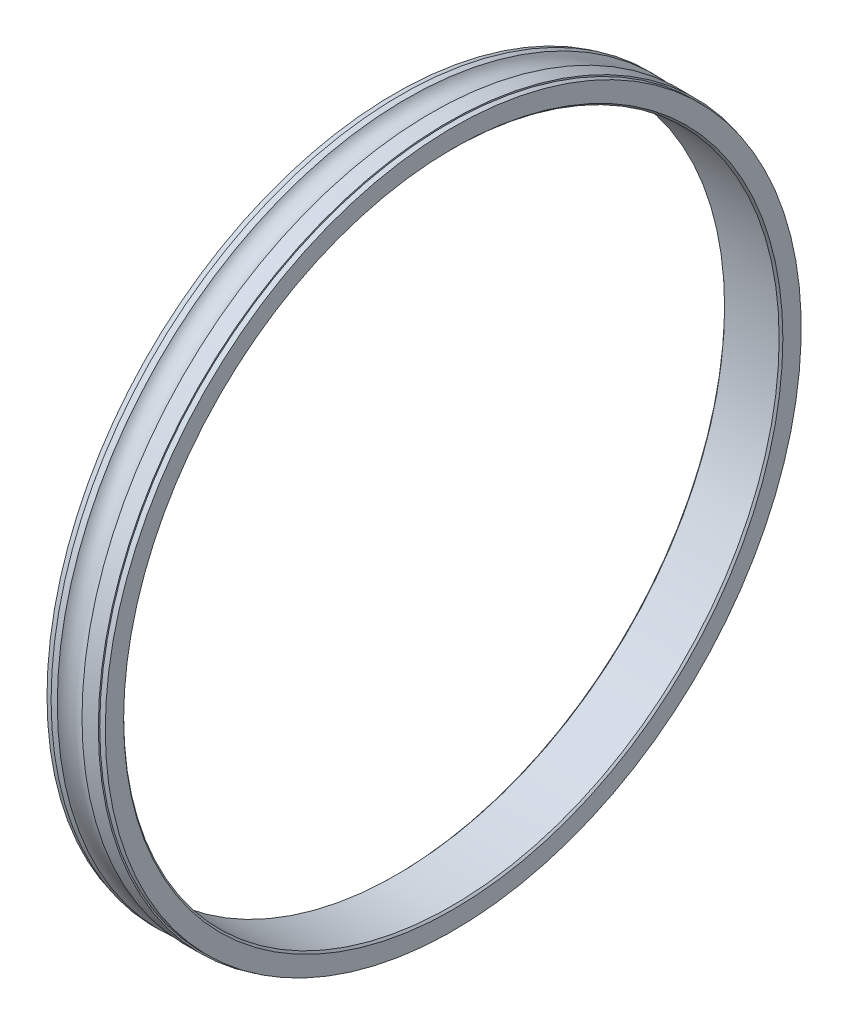
ISO-10303-21;
HEADER;
FILE_DESCRIPTION(('STEP AP214'),'2;1');
FILE_NAME('part.step','',(''),(''),'','','');
FILE_SCHEMA(('AUTOMOTIVE_DESIGN { 1 0 10303 214 1 1 1 1 }'));
ENDSEC;
DATA;
#1=APPLICATION_CONTEXT('core data for automotive mechanical design processes');
#2=APPLICATION_PROTOCOL_DEFINITION('international standard','automotive_design',2000,#1);
#3=PRODUCT_CONTEXT('',#1,'mechanical');
#4=PRODUCT('Part','Part','',(#3));
#5=PRODUCT_RELATED_PRODUCT_CATEGORY('part','',(#4));
#6=PRODUCT_DEFINITION_FORMATION('','',#4);
#7=PRODUCT_DEFINITION_CONTEXT('part definition',#1,'design');
#8=PRODUCT_DEFINITION('design','',#6,#7);
#9=PRODUCT_DEFINITION_SHAPE('','',#8);
#10=(LENGTH_UNIT() NAMED_UNIT(*) SI_UNIT(.MILLI.,.METRE.));
#11=(NAMED_UNIT(*) PLANE_ANGLE_UNIT() SI_UNIT($,.RADIAN.));
#12=(NAMED_UNIT(*) SI_UNIT($,.STERADIAN.) SOLID_ANGLE_UNIT());
#13=UNCERTAINTY_MEASURE_WITH_UNIT(LENGTH_MEASURE(1.E-05),#10,'distance_accuracy_value','');
#14=(GEOMETRIC_REPRESENTATION_CONTEXT(3) GLOBAL_UNCERTAINTY_ASSIGNED_CONTEXT((#13)) GLOBAL_UNIT_ASSIGNED_CONTEXT((#10,
#11,#12)) REPRESENTATION_CONTEXT('',''));
#15=CARTESIAN_POINT('',(0.,0.,0.));
#16=DIRECTION('',(0.,0.,1.));
#17=DIRECTION('',(1.,0.,0.));
#18=AXIS2_PLACEMENT_3D('',#15,#16,#17);
#19=CARTESIAN_POINT('',(-4.,-48.3043680150376,-47.775));
#20=DIRECTION('',(-1.,0.,0.));
#21=DIRECTION('',(0.,0.,1.));
#22=AXIS2_PLACEMENT_3D('',#19,#20,#21);
#23=PLANE('',#22);
#24=CARTESIAN_POINT('',(-4.,0.,0.));
#25=DIRECTION('',(-1.,0.,0.));
#26=DIRECTION('',(0.,0.,-1.));
#27=AXIS2_PLACEMENT_3D('',#24,#25,#26);
#28=CIRCLE('',#27,47.775);
#29=CARTESIAN_POINT('',(-4.,0.,-47.775));
#30=VERTEX_POINT('',#29);
#31=EDGE_CURVE('E56',#30,#30,#28,.F.);
#32=ORIENTED_EDGE('',*,*,#31,.F.);
#33=EDGE_LOOP('',(#32));
#34=FACE_BOUND('',#33,.T.);
#35=CARTESIAN_POINT('',(-4.,0.,0.));
#36=DIRECTION('',(1.,0.,0.));
#37=DIRECTION('',(0.,0.,1.));
#38=AXIS2_PLACEMENT_3D('',#35,#36,#37);
#39=CIRCLE('',#38,45.254558441227);
#40=CARTESIAN_POINT('',(-4.,0.,45.254558441227));
#41=VERTEX_POINT('',#40);
#42=EDGE_CURVE('E53',#41,#41,#39,.T.);
#43=ORIENTED_EDGE('',*,*,#42,.T.);
#44=EDGE_LOOP('',(#43));
#45=FACE_BOUND('',#44,.T.);
#46=ADVANCED_FACE('F15',(#34,#45),#23,.T.);
#47=CARTESIAN_POINT('',(4.,-48.3043679381441,47.775));
#48=DIRECTION('',(1.,0.,0.));
#49=DIRECTION('',(0.,0.,-1.));
#50=AXIS2_PLACEMENT_3D('',#47,#48,#49);
#51=PLANE('',#50);
#52=CARTESIAN_POINT('',(4.,0.,0.));
#53=DIRECTION('',(1.,0.,0.));
#54=DIRECTION('',(0.,-1.16852712749299E-09,1.));
#55=AXIS2_PLACEMENT_3D('',#52,#53,#54);
#56=CIRCLE('',#55,47.775);
#57=CARTESIAN_POINT('',(4.,-5.58263835159778E-08,47.775));
#58=VERTEX_POINT('',#57);
#59=EDGE_CURVE('E50',#58,#58,#56,.T.);
#60=ORIENTED_EDGE('',*,*,#59,.T.);
#61=EDGE_LOOP('',(#60));
#62=FACE_BOUND('',#61,.T.);
#63=CARTESIAN_POINT('',(4.,0.,0.));
#64=DIRECTION('',(-1.,0.,0.));
#65=DIRECTION('',(0.,0.,-1.));
#66=AXIS2_PLACEMENT_3D('',#63,#64,#65);
#67=CIRCLE('',#66,45.254558441227);
#68=CARTESIAN_POINT('',(4.,0.,-45.254558441227));
#69=VERTEX_POINT('',#68);
#70=EDGE_CURVE('E47',#69,#69,#67,.F.);
#71=ORIENTED_EDGE('',*,*,#70,.F.);
#72=EDGE_LOOP('',(#71));
#73=FACE_BOUND('',#72,.T.);
#74=ADVANCED_FACE('F64',(#62,#73),#51,.T.);
#75=CARTESIAN_POINT('',(-3.24,-48.5015287008133,47.97));
#76=DIRECTION('',(-1.,0.,0.));
#77=DIRECTION('',(0.,1.,0.));
#78=AXIS2_PLACEMENT_3D('',#75,#76,#77);
#79=PLANE('',#78);
#80=CARTESIAN_POINT('',(-3.24,0.,0.));
#81=DIRECTION('',(-1.,0.,0.));
#82=DIRECTION('',(0.,0.,-1.));
#83=AXIS2_PLACEMENT_3D('',#80,#81,#82);
#84=CIRCLE('',#83,47.97);
#85=CARTESIAN_POINT('',(-3.24,0.,-47.97));
#86=VERTEX_POINT('',#85);
#87=EDGE_CURVE('E44',#86,#86,#84,.F.);
#88=ORIENTED_EDGE('',*,*,#87,.F.);
#89=EDGE_LOOP('',(#88));
#90=FACE_BOUND('',#89,.T.);
#91=CARTESIAN_POINT('',(-3.24,0.,0.));
#92=DIRECTION('',(1.,0.,0.));
#93=DIRECTION('',(0.,-1.16852727621989E-09,1.));
#94=AXIS2_PLACEMENT_3D('',#91,#92,#93);
#95=CIRCLE('',#94,47.775);
#96=CARTESIAN_POINT('',(-3.24,-5.58263906214052E-08,47.775));
#97=VERTEX_POINT('',#96);
#98=EDGE_CURVE('E41',#97,#97,#95,.T.);
#99=ORIENTED_EDGE('',*,*,#98,.T.);
#100=EDGE_LOOP('',(#99));
#101=FACE_BOUND('',#100,.T.);
#102=ADVANCED_FACE('F107',(#90,#101),#79,.T.);
#103=CARTESIAN_POINT('',(3.24,-48.5015287008133,-47.97));
#104=DIRECTION('',(1.,0.,0.));
#105=DIRECTION('',(0.,1.,0.));
#106=AXIS2_PLACEMENT_3D('',#103,#104,#105);
#107=PLANE('',#106);
#108=CARTESIAN_POINT('',(3.24,0.,0.));
#109=DIRECTION('',(1.,0.,0.));
#110=DIRECTION('',(0.,0.,1.));
#111=AXIS2_PLACEMENT_3D('',#108,#109,#110);
#112=CIRCLE('',#111,47.97);
#113=CARTESIAN_POINT('',(3.24,0.,47.97));
#114=VERTEX_POINT('',#113);
#115=EDGE_CURVE('E38',#114,#114,#112,.T.);
#116=ORIENTED_EDGE('',*,*,#115,.T.);
#117=EDGE_LOOP('',(#116));
#118=FACE_BOUND('',#117,.T.);
#119=CARTESIAN_POINT('',(3.24,0.,0.));
#120=DIRECTION('',(-1.,0.,0.));
#121=DIRECTION('',(0.,0.,-1.));
#122=AXIS2_PLACEMENT_3D('',#119,#120,#121);
#123=CIRCLE('',#122,47.775);
#124=CARTESIAN_POINT('',(3.24,0.,-47.775));
#125=VERTEX_POINT('',#124);
#126=EDGE_CURVE('E35',#125,#125,#123,.F.);
#127=ORIENTED_EDGE('',*,*,#126,.F.);
#128=EDGE_LOOP('',(#127));
#129=FACE_BOUND('',#128,.T.);
#130=ADVANCED_FACE('F72',(#118,#129),#107,.T.);
#131=CARTESIAN_POINT('',(-4.00000000000001,0.,0.));
#132=DIRECTION('',(-1.,0.,0.));
#133=DIRECTION('',(0.,0.,-1.));
#134=AXIS2_PLACEMENT_3D('',#131,#132,#133);
#135=CONICAL_SURFACE('',#134,45.254558441227,0.785398163397052);
#136=ORIENTED_EDGE('',*,*,#42,.F.);
#137=EDGE_LOOP('',(#136));
#138=FACE_BOUND('',#137,.T.);
#139=CARTESIAN_POINT('',(-3.7454415587728,0.,0.));
#140=DIRECTION('',(1.,0.,0.));
#141=DIRECTION('',(0.,0.,1.));
#142=AXIS2_PLACEMENT_3D('',#139,#140,#141);
#143=CIRCLE('',#142,45.);
#144=CARTESIAN_POINT('',(-3.7454415587728,0.,45.));
#145=VERTEX_POINT('',#144);
#146=EDGE_CURVE('E30',#145,#145,#143,.T.);
#147=ORIENTED_EDGE('',*,*,#146,.T.);
#148=EDGE_LOOP('',(#147));
#149=FACE_BOUND('',#148,.T.);
#150=ADVANCED_FACE('F68',(#138,#149),#135,.F.);
#151=CARTESIAN_POINT('',(4.,0.,0.));
#152=DIRECTION('',(1.,0.,0.));
#153=DIRECTION('',(0.,0.,1.));
#154=AXIS2_PLACEMENT_3D('',#151,#152,#153);
#155=CYLINDRICAL_SURFACE('',#154,45.);
#156=CARTESIAN_POINT('',(3.7454415587728,0.,0.));
#157=DIRECTION('',(1.,0.,0.));
#158=DIRECTION('',(0.,0.,1.));
#159=AXIS2_PLACEMENT_3D('',#156,#157,#158);
#160=CIRCLE('',#159,45.);
#161=CARTESIAN_POINT('',(3.7454415587728,0.,45.));
#162=VERTEX_POINT('',#161);
#163=EDGE_CURVE('E26',#162,#162,#160,.T.);
#164=ORIENTED_EDGE('',*,*,#163,.T.);
#165=EDGE_LOOP('',(#164));
#166=FACE_BOUND('',#165,.T.);
#167=ORIENTED_EDGE('',*,*,#146,.F.);
#168=EDGE_LOOP('',(#167));
#169=FACE_BOUND('',#168,.T.);
#170=ADVANCED_FACE('F71',(#166,#169),#155,.F.);
#171=CARTESIAN_POINT('',(4.,0.,0.));
#172=DIRECTION('',(1.,0.,0.));
#173=DIRECTION('',(0.,0.,1.));
#174=AXIS2_PLACEMENT_3D('',#171,#172,#173);
#175=CONICAL_SURFACE('',#174,45.254558441227,0.785398163397061);
#176=ORIENTED_EDGE('',*,*,#70,.T.);
#177=EDGE_LOOP('',(#176));
#178=FACE_BOUND('',#177,.T.);
#179=ORIENTED_EDGE('',*,*,#163,.F.);
#180=EDGE_LOOP('',(#179));
#181=FACE_BOUND('',#180,.T.);
#182=ADVANCED_FACE('F77',(#178,#181),#175,.F.);
#183=CARTESIAN_POINT('',(10.,0.,0.));
#184=DIRECTION('',(1.,0.,0.));
#185=DIRECTION('',(0.,0.,1.));
#186=AXIS2_PLACEMENT_3D('',#183,#184,#185);
#187=CYLINDRICAL_SURFACE('',#186,47.775);
#188=ORIENTED_EDGE('',*,*,#98,.F.);
#189=EDGE_LOOP('',(#188));
#190=FACE_BOUND('',#189,.T.);
#191=ORIENTED_EDGE('',*,*,#31,.T.);
#192=EDGE_LOOP('',(#191));
#193=FACE_BOUND('',#192,.T.);
#194=ADVANCED_FACE('F60',(#190,#193),#187,.T.);
#195=CARTESIAN_POINT('',(4.,0.,0.));
#196=DIRECTION('',(1.,0.,0.));
#197=DIRECTION('',(0.,0.,1.));
#198=AXIS2_PLACEMENT_3D('',#195,#196,#197);
#199=CYLINDRICAL_SURFACE('',#198,47.97);
#200=CARTESIAN_POINT('',(0.99727245747847,0.,0.));
#201=DIRECTION('',(1.,0.,0.));
#202=DIRECTION('',(0.,0.,1.));
#203=AXIS2_PLACEMENT_3D('',#200,#201,#202);
#204=CIRCLE('',#203,47.97);
#205=CARTESIAN_POINT('',(0.99727245747847,0.,47.97));
#206=VERTEX_POINT('',#205);
#207=EDGE_CURVE('E22',#206,#206,#204,.T.);
#208=ORIENTED_EDGE('',*,*,#207,.T.);
#209=EDGE_LOOP('',(#208));
#210=FACE_BOUND('',#209,.T.);
#211=ORIENTED_EDGE('',*,*,#115,.F.);
#212=EDGE_LOOP('',(#211));
#213=FACE_BOUND('',#212,.T.);
#214=ADVANCED_FACE('F90',(#210,#213),#199,.T.);
#215=CARTESIAN_POINT('',(-0.69900000000002,0.,0.));
#216=DIRECTION('',(1.,0.,0.));
#217=DIRECTION('',(0.,0.,1.));
#218=AXIS2_PLACEMENT_3D('',#215,#216,#217);
#219=TOROIDAL_SURFACE('',#218,49.,1.98450000000004);
#220=ORIENTED_EDGE('',*,*,#207,.F.);
#221=EDGE_LOOP('',(#220));
#222=FACE_BOUND('',#221,.T.);
#223=CARTESIAN_POINT('',(-2.39527245747852,0.,0.));
#224=DIRECTION('',(1.,0.,0.));
#225=DIRECTION('',(0.,0.,1.));
#226=AXIS2_PLACEMENT_3D('',#223,#224,#225);
#227=CIRCLE('',#226,47.97);
#228=CARTESIAN_POINT('',(-2.39527245747852,0.,47.97));
#229=VERTEX_POINT('',#228);
#230=EDGE_CURVE('E10',#229,#229,#227,.T.);
#231=ORIENTED_EDGE('',*,*,#230,.T.);
#232=EDGE_LOOP('',(#231));
#233=FACE_BOUND('',#232,.T.);
#234=ADVANCED_FACE('F94',(#222,#233),#219,.F.);
#235=CARTESIAN_POINT('',(4.,0.,0.));
#236=DIRECTION('',(1.,0.,0.));
#237=DIRECTION('',(0.,0.,1.));
#238=AXIS2_PLACEMENT_3D('',#235,#236,#237);
#239=CYLINDRICAL_SURFACE('',#238,47.97);
#240=ORIENTED_EDGE('',*,*,#87,.T.);
#241=EDGE_LOOP('',(#240));
#242=FACE_BOUND('',#241,.T.);
#243=ORIENTED_EDGE('',*,*,#230,.F.);
#244=EDGE_LOOP('',(#243));
#245=FACE_BOUND('',#244,.T.);
#246=ADVANCED_FACE('F96',(#242,#245),#239,.T.);
#247=CARTESIAN_POINT('',(10.,0.,0.));
#248=DIRECTION('',(1.,0.,0.));
#249=DIRECTION('',(0.,0.,1.));
#250=AXIS2_PLACEMENT_3D('',#247,#248,#249);
#251=CYLINDRICAL_SURFACE('',#250,47.775);
#252=ORIENTED_EDGE('',*,*,#59,.F.);
#253=EDGE_LOOP('',(#252));
#254=FACE_BOUND('',#253,.T.);
#255=ORIENTED_EDGE('',*,*,#126,.T.);
#256=EDGE_LOOP('',(#255));
#257=FACE_BOUND('',#256,.T.);
#258=ADVANCED_FACE('F17',(#254,#257),#251,.T.);
#259=CLOSED_SHELL('',(#46,#74,#102,#130,#150,#170,#182,#194,#214,#234,#246,#258));
#260=MANIFOLD_SOLID_BREP('B1',#259);
#261=ADVANCED_BREP_SHAPE_REPRESENTATION('',(#18,#260),#14);
#262=SHAPE_DEFINITION_REPRESENTATION(#9,#261);
ENDSEC;
END-ISO-10303-21;
